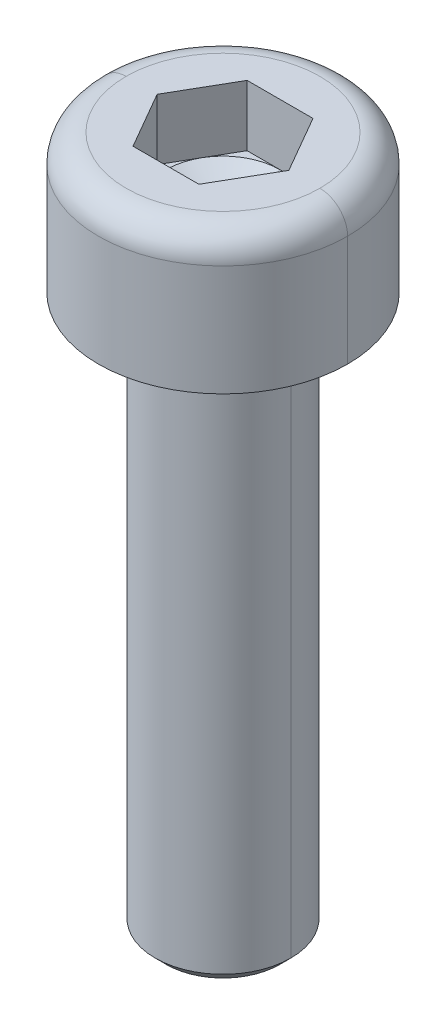
ISO-10303-21;
HEADER;
FILE_DESCRIPTION(('STEP AP214'),'2;1');
FILE_NAME('part.step','',(''),(''),'','','');
FILE_SCHEMA(('AUTOMOTIVE_DESIGN { 1 0 10303 214 1 1 1 1 }'));
ENDSEC;
DATA;
#1=APPLICATION_CONTEXT('core data for automotive mechanical design processes');
#2=APPLICATION_PROTOCOL_DEFINITION('international standard','automotive_design',2000,#1);
#3=PRODUCT_CONTEXT('',#1,'mechanical');
#4=PRODUCT('Part','Part','',(#3));
#5=PRODUCT_RELATED_PRODUCT_CATEGORY('part','',(#4));
#6=PRODUCT_DEFINITION_FORMATION('','',#4);
#7=PRODUCT_DEFINITION_CONTEXT('part definition',#1,'design');
#8=PRODUCT_DEFINITION('design','',#6,#7);
#9=PRODUCT_DEFINITION_SHAPE('','',#8);
#10=(LENGTH_UNIT() NAMED_UNIT(*) SI_UNIT(.MILLI.,.METRE.));
#11=(NAMED_UNIT(*) PLANE_ANGLE_UNIT() SI_UNIT($,.RADIAN.));
#12=(NAMED_UNIT(*) SI_UNIT($,.STERADIAN.) SOLID_ANGLE_UNIT());
#13=UNCERTAINTY_MEASURE_WITH_UNIT(LENGTH_MEASURE(1.E-05),#10,'distance_accuracy_value','');
#14=(GEOMETRIC_REPRESENTATION_CONTEXT(3) GLOBAL_UNCERTAINTY_ASSIGNED_CONTEXT((#13)) GLOBAL_UNIT_ASSIGNED_CONTEXT((#10,
#11,#12)) REPRESENTATION_CONTEXT('',''));
#15=CARTESIAN_POINT('',(0.,0.,0.));
#16=DIRECTION('',(0.,0.,1.));
#17=DIRECTION('',(1.,0.,0.));
#18=AXIS2_PLACEMENT_3D('',#15,#16,#17);
#19=CARTESIAN_POINT('',(0.,-10.,0.));
#20=DIRECTION('',(0.,-1.,0.));
#21=DIRECTION('',(0.,0.,-1.));
#22=AXIS2_PLACEMENT_3D('',#19,#20,#21);
#23=PLANE('',#22);
#24=CARTESIAN_POINT('',(0.,-9.999997107335,0.));
#25=DIRECTION('',(0.,1.,0.));
#26=DIRECTION('',(-1.,0.,0.));
#27=AXIS2_PLACEMENT_3D('',#24,#25,#26);
#28=CIRCLE('',#27,1.024996411826);
#29=CARTESIAN_POINT('',(-1.024996411826,-9.999997107335,0.));
#30=VERTEX_POINT('',#29);
#31=CARTESIAN_POINT('',(1.024996411826,-9.999997107335,0.));
#32=VERTEX_POINT('',#31);
#33=EDGE_CURVE('P0_E40',#30,#32,#28,.T.);
#34=ORIENTED_EDGE('',*,*,#33,.F.);
#35=CARTESIAN_POINT('',(0.,-9.999997107335,0.));
#36=DIRECTION('',(0.,1.,0.));
#37=DIRECTION('',(1.,0.,0.));
#38=AXIS2_PLACEMENT_3D('',#35,#36,#37);
#39=CIRCLE('',#38,1.024996411826);
#40=EDGE_CURVE('P0_E27',#32,#30,#39,.T.);
#41=ORIENTED_EDGE('',*,*,#40,.F.);
#42=EDGE_LOOP('',(#34,#41));
#43=FACE_BOUND('',#42,.T.);
#44=ADVANCED_FACE('P0_F16',(#43),#23,.T.);
#45=CARTESIAN_POINT('',(0.,-9.899996151815,0.));
#46=DIRECTION('',(0.,1.,0.));
#47=DIRECTION('',(0.,0.,-1.));
#48=AXIS2_PLACEMENT_3D('',#45,#46,#47);
#49=CONICAL_SURFACE('',#48,1.124996735065,0.785395002011216);
#50=DIRECTION('',(-0.707107572903604,-0.707105989468604,-3.40279915932002E-11));
#51=VECTOR('',#50,1.);
#52=CARTESIAN_POINT('',(1.224998063554,-9.799998063748,-8.322229612649E-11));
#53=LINE('',#52,#51);
#54=CARTESIAN_POINT('',(1.225,-9.799999164903,0.));
#55=VERTEX_POINT('',#54);
#56=EDGE_CURVE('P0_E11',#55,#32,#53,.T.);
#57=ORIENTED_EDGE('',*,*,#56,.T.);
#58=ORIENTED_EDGE('',*,*,#40,.T.);
#59=DIRECTION('',(0.707107572903604,-0.707105989468604,3.40272958864702E-11));
#60=VECTOR('',#59,1.);
#61=CARTESIAN_POINT('',(-1.224998063554,-9.799998063748,8.322240294935E-11));
#62=LINE('',#61,#60);
#63=CARTESIAN_POINT('',(-1.225,-9.799999164903,0.));
#64=VERTEX_POINT('',#63);
#65=EDGE_CURVE('P0_E179',#64,#30,#62,.T.);
#66=ORIENTED_EDGE('',*,*,#65,.F.);
#67=CARTESIAN_POINT('',(0.,-9.799999164903,0.));
#68=DIRECTION('',(0.,1.,0.));
#69=DIRECTION('',(1.,0.,0.));
#70=AXIS2_PLACEMENT_3D('',#67,#68,#69);
#71=CIRCLE('',#70,1.225);
#72=EDGE_CURVE('P0_E182',#55,#64,#71,.T.);
#73=ORIENTED_EDGE('',*,*,#72,.F.);
#74=EDGE_LOOP('',(#57,#58,#66,#73));
#75=FACE_BOUND('',#74,.T.);
#76=ADVANCED_FACE('P0_F181',(#75),#49,.T.);
#77=CARTESIAN_POINT('',(0.,3.125,0.));
#78=DIRECTION('',(0.,-1.,0.));
#79=DIRECTION('',(-1.,0.,0.));
#80=AXIS2_PLACEMENT_3D('',#77,#78,#79);
#81=CYLINDRICAL_SURFACE('',#80,1.225);
#82=DIRECTION('',(-2.01713195104496E-07,0.99999999999998,-8.66901768270682E-12));
#83=VECTOR('',#82,1.);
#84=CARTESIAN_POINT('',(-1.224998063554,-9.799998063748,8.322240294935E-11));
#85=LINE('',#84,#83);
#86=CARTESIAN_POINT('',(-1.225,-0.2,0.));
#87=VERTEX_POINT('',#86);
#88=EDGE_CURVE('P0_E193',#64,#87,#85,.T.);
#89=ORIENTED_EDGE('',*,*,#88,.T.);
#90=CARTESIAN_POINT('',(0.,-0.2,0.));
#91=DIRECTION('',(0.,1.,0.));
#92=DIRECTION('',(1.,0.,0.));
#93=AXIS2_PLACEMENT_3D('',#90,#91,#92);
#94=CIRCLE('',#93,1.225);
#95=CARTESIAN_POINT('',(1.225,-0.2,0.));
#96=VERTEX_POINT('',#95);
#97=EDGE_CURVE('P0_E301',#96,#87,#94,.T.);
#98=ORIENTED_EDGE('',*,*,#97,.F.);
#99=DIRECTION('',(2.01713195312696E-07,0.99999999999998,8.66900655532282E-12));
#100=VECTOR('',#99,1.);
#101=CARTESIAN_POINT('',(1.224998063554,-9.799998063748,-8.322229612649E-11));
#102=LINE('',#101,#100);
#103=EDGE_CURVE('P0_E196',#55,#96,#102,.T.);
#104=ORIENTED_EDGE('',*,*,#103,.F.);
#105=ORIENTED_EDGE('',*,*,#72,.T.);
#106=EDGE_LOOP('',(#89,#98,#104,#105));
#107=FACE_BOUND('',#106,.T.);
#108=ADVANCED_FACE('P0_F192',(#107),#81,.T.);
#109=CARTESIAN_POINT('',(0.,3.125,0.));
#110=DIRECTION('',(0.,-1.,0.));
#111=DIRECTION('',(-1.,0.,0.));
#112=AXIS2_PLACEMENT_3D('',#109,#110,#111);
#113=CYLINDRICAL_SURFACE('',#112,1.225);
#114=ORIENTED_EDGE('',*,*,#103,.T.);
#115=CARTESIAN_POINT('',(0.,-0.2,0.));
#116=DIRECTION('',(0.,-1.,0.));
#117=DIRECTION('',(1.,0.,0.));
#118=AXIS2_PLACEMENT_3D('',#115,#116,#117);
#119=CIRCLE('',#118,1.225);
#120=EDGE_CURVE('P0_E204',#96,#87,#119,.T.);
#121=ORIENTED_EDGE('',*,*,#120,.T.);
#122=ORIENTED_EDGE('',*,*,#88,.F.);
#123=CARTESIAN_POINT('',(0.,-9.799999164903,0.));
#124=DIRECTION('',(0.,1.,0.));
#125=DIRECTION('',(-1.,0.,0.));
#126=AXIS2_PLACEMENT_3D('',#123,#124,#125);
#127=CIRCLE('',#126,1.225);
#128=EDGE_CURVE('P0_E187',#64,#55,#127,.T.);
#129=ORIENTED_EDGE('',*,*,#128,.T.);
#130=EDGE_LOOP('',(#114,#121,#122,#129));
#131=FACE_BOUND('',#130,.T.);
#132=ADVANCED_FACE('P0_F202',(#131),#113,.T.);
#133=CARTESIAN_POINT('',(0.,-9.899996151815,0.));
#134=DIRECTION('',(0.,1.,0.));
#135=DIRECTION('',(0.,0.,-1.));
#136=AXIS2_PLACEMENT_3D('',#133,#134,#135);
#137=CONICAL_SURFACE('',#136,1.124996735065,0.785395002011216);
#138=ORIENTED_EDGE('',*,*,#65,.T.);
#139=ORIENTED_EDGE('',*,*,#33,.T.);
#140=ORIENTED_EDGE('',*,*,#56,.F.);
#141=ORIENTED_EDGE('',*,*,#128,.F.);
#142=EDGE_LOOP('',(#138,#139,#140,#141));
#143=FACE_BOUND('',#142,.T.);
#144=ADVANCED_FACE('P0_F207',(#143),#137,.T.);
#145=CARTESIAN_POINT('',(0.,-0.2,0.));
#146=DIRECTION('',(0.,-1.,0.));
#147=DIRECTION('',(-1.,0.,0.));
#148=AXIS2_PLACEMENT_3D('',#145,#146,#147);
#149=TOROIDAL_SURFACE('',#148,1.425,0.2);
#150=CARTESIAN_POINT('',(0.,0.,0.));
#151=DIRECTION('',(0.,-1.,0.));
#152=DIRECTION('',(1.,0.,0.));
#153=AXIS2_PLACEMENT_3D('',#150,#151,#152);
#154=CIRCLE('',#153,1.425);
#155=CARTESIAN_POINT('',(1.425,0.,0.));
#156=VERTEX_POINT('',#155);
#157=CARTESIAN_POINT('',(-1.425,0.,0.));
#158=VERTEX_POINT('',#157);
#159=EDGE_CURVE('P0_E326',#156,#158,#154,.T.);
#160=ORIENTED_EDGE('',*,*,#159,.T.);
#161=CARTESIAN_POINT('',(-1.425,-0.2,0.));
#162=DIRECTION('',(0.,0.,1.));
#163=DIRECTION('',(1.,0.,0.));
#164=AXIS2_PLACEMENT_3D('',#161,#162,#163);
#165=CIRCLE('',#164,0.2);
#166=EDGE_CURVE('P0_E285',#87,#158,#165,.T.);
#167=ORIENTED_EDGE('',*,*,#166,.F.);
#168=ORIENTED_EDGE('',*,*,#120,.F.);
#169=CARTESIAN_POINT('',(1.425,-0.2,0.));
#170=DIRECTION('',(0.,0.,-1.));
#171=DIRECTION('',(-1.,0.,0.));
#172=AXIS2_PLACEMENT_3D('',#169,#170,#171);
#173=CIRCLE('',#172,0.2);
#174=EDGE_CURVE('P0_E303',#96,#156,#173,.T.);
#175=ORIENTED_EDGE('',*,*,#174,.T.);
#176=EDGE_LOOP('',(#160,#167,#168,#175));
#177=FACE_BOUND('',#176,.T.);
#178=ADVANCED_FACE('P0_F453',(#177),#149,.F.);
#179=CARTESIAN_POINT('',(0.,-0.2,0.));
#180=DIRECTION('',(0.,-1.,0.));
#181=DIRECTION('',(-1.,0.,0.));
#182=AXIS2_PLACEMENT_3D('',#179,#180,#181);
#183=TOROIDAL_SURFACE('',#182,1.425,0.2);
#184=ORIENTED_EDGE('',*,*,#97,.T.);
#185=ORIENTED_EDGE('',*,*,#166,.T.);
#186=CARTESIAN_POINT('',(0.,0.,0.));
#187=DIRECTION('',(0.,1.,0.));
#188=DIRECTION('',(1.,0.,0.));
#189=AXIS2_PLACEMENT_3D('',#186,#187,#188);
#190=CIRCLE('',#189,1.425);
#191=EDGE_CURVE('P0_E286',#156,#158,#190,.T.);
#192=ORIENTED_EDGE('',*,*,#191,.F.);
#193=ORIENTED_EDGE('',*,*,#174,.F.);
#194=EDGE_LOOP('',(#184,#185,#192,#193));
#195=FACE_BOUND('',#194,.T.);
#196=ADVANCED_FACE('P0_F495',(#195),#183,.F.);
#197=CARTESIAN_POINT('',(0.,0.,0.));
#198=DIRECTION('',(0.,-1.,0.));
#199=DIRECTION('',(0.,0.,-1.));
#200=AXIS2_PLACEMENT_3D('',#197,#198,#199);
#201=PLANE('',#200);
#202=CARTESIAN_POINT('',(0.,0.,0.));
#203=DIRECTION('',(0.,-1.,0.));
#204=DIRECTION('',(1.,0.,0.));
#205=AXIS2_PLACEMENT_3D('',#202,#203,#204);
#206=CIRCLE('',#205,2.25);
#207=CARTESIAN_POINT('',(2.25,0.,0.));
#208=VERTEX_POINT('',#207);
#209=CARTESIAN_POINT('',(-2.25,0.,0.));
#210=VERTEX_POINT('',#209);
#211=EDGE_CURVE('P0_E281',#208,#210,#206,.T.);
#212=ORIENTED_EDGE('',*,*,#211,.T.);
#213=CARTESIAN_POINT('',(0.,0.,0.));
#214=DIRECTION('',(0.,1.,0.));
#215=DIRECTION('',(1.,0.,0.));
#216=AXIS2_PLACEMENT_3D('',#213,#214,#215);
#217=CIRCLE('',#216,2.25);
#218=EDGE_CURVE('P0_E334',#208,#210,#217,.T.);
#219=ORIENTED_EDGE('',*,*,#218,.F.);
#220=EDGE_LOOP('',(#212,#219));
#221=FACE_BOUND('',#220,.T.);
#222=ORIENTED_EDGE('',*,*,#191,.T.);
#223=ORIENTED_EDGE('',*,*,#159,.F.);
#224=EDGE_LOOP('',(#222,#223));
#225=FACE_BOUND('',#224,.T.);
#226=ADVANCED_FACE('P0_F493',(#221,#225),#201,.T.);
#227=CARTESIAN_POINT('',(0.,3.125,0.));
#228=DIRECTION('',(0.,-1.,0.));
#229=DIRECTION('',(-1.,0.,0.));
#230=AXIS2_PLACEMENT_3D('',#227,#228,#229);
#231=CYLINDRICAL_SURFACE('',#230,2.25);
#232=DIRECTION('',(0.,1.,2.126647948581E-11));
#233=VECTOR('',#232,1.);
#234=CARTESIAN_POINT('',(2.25,0.,0.));
#235=LINE('',#234,#233);
#236=CARTESIAN_POINT('',(2.25,2.,0.));
#237=VERTEX_POINT('',#236);
#238=EDGE_CURVE('P0_E371',#208,#237,#235,.T.);
#239=ORIENTED_EDGE('',*,*,#238,.F.);
#240=ORIENTED_EDGE('',*,*,#218,.T.);
#241=DIRECTION('',(0.,1.,-2.126718873643E-11));
#242=VECTOR('',#241,1.);
#243=CARTESIAN_POINT('',(-2.25,0.,0.));
#244=LINE('',#243,#242);
#245=CARTESIAN_POINT('',(-2.25,2.,0.));
#246=VERTEX_POINT('',#245);
#247=EDGE_CURVE('P0_E308',#210,#246,#244,.T.);
#248=ORIENTED_EDGE('',*,*,#247,.T.);
#249=CARTESIAN_POINT('',(0.,2.,0.));
#250=DIRECTION('',(0.,1.,0.));
#251=DIRECTION('',(1.,0.,0.));
#252=AXIS2_PLACEMENT_3D('',#249,#250,#251);
#253=CIRCLE('',#252,2.25);
#254=EDGE_CURVE('P0_E287',#237,#246,#253,.T.);
#255=ORIENTED_EDGE('',*,*,#254,.F.);
#256=EDGE_LOOP('',(#239,#240,#248,#255));
#257=FACE_BOUND('',#256,.T.);
#258=ADVANCED_FACE('P0_F490',(#257),#231,.T.);
#259=CARTESIAN_POINT('',(0.,2.,0.));
#260=DIRECTION('',(0.,-1.,0.));
#261=DIRECTION('',(0.999907289977928,0.,0.0136165872742304));
#262=AXIS2_PLACEMENT_3D('',#259,#260,#261);
#263=TOROIDAL_SURFACE('',#262,1.75,0.5);
#264=CARTESIAN_POINT('',(1.75,2.,0.));
#265=DIRECTION('',(0.,0.,-1.));
#266=DIRECTION('',(0.,1.,0.));
#267=AXIS2_PLACEMENT_3D('',#264,#265,#266);
#268=CIRCLE('',#267,0.5);
#269=CARTESIAN_POINT('',(1.749999979037,2.5,0.));
#270=VERTEX_POINT('',#269);
#271=EDGE_CURVE('P0_E291',#270,#237,#268,.T.);
#272=ORIENTED_EDGE('',*,*,#271,.T.);
#273=ORIENTED_EDGE('',*,*,#254,.T.);
#274=CARTESIAN_POINT('',(-1.75,2.,0.));
#275=DIRECTION('',(0.,0.,1.));
#276=DIRECTION('',(0.,1.,0.));
#277=AXIS2_PLACEMENT_3D('',#274,#275,#276);
#278=CIRCLE('',#277,0.5);
#279=CARTESIAN_POINT('',(-1.749999979037,2.5,0.));
#280=VERTEX_POINT('',#279);
#281=EDGE_CURVE('P0_E359',#280,#246,#278,.T.);
#282=ORIENTED_EDGE('',*,*,#281,.F.);
#283=CARTESIAN_POINT('',(0.,2.5,0.));
#284=DIRECTION('',(0.,1.,0.));
#285=DIRECTION('',(1.,0.,0.));
#286=AXIS2_PLACEMENT_3D('',#283,#284,#285);
#287=CIRCLE('',#286,1.749999979037);
#288=EDGE_CURVE('P0_E296',#270,#280,#287,.T.);
#289=ORIENTED_EDGE('',*,*,#288,.F.);
#290=EDGE_LOOP('',(#272,#273,#282,#289));
#291=FACE_BOUND('',#290,.T.);
#292=ADVANCED_FACE('P0_F18',(#291),#263,.T.);
#293=CARTESIAN_POINT('',(0.,2.5,0.));
#294=DIRECTION('',(0.,-1.,0.));
#295=DIRECTION('',(0.,0.,-1.));
#296=AXIS2_PLACEMENT_3D('',#293,#294,#295);
#297=PLANE('',#296);
#298=CARTESIAN_POINT('',(0.,2.5,0.));
#299=DIRECTION('',(0.,1.,0.));
#300=DIRECTION('',(-1.,0.,0.));
#301=AXIS2_PLACEMENT_3D('',#298,#299,#300);
#302=CIRCLE('',#301,1.749999979037);
#303=EDGE_CURVE('P0_E292',#280,#270,#302,.T.);
#304=ORIENTED_EDGE('',*,*,#303,.T.);
#305=ORIENTED_EDGE('',*,*,#288,.T.);
#306=EDGE_LOOP('',(#304,#305));
#307=FACE_BOUND('',#306,.T.);
#308=DIRECTION('',(0.500000000000017,0.,-0.866025403784429));
#309=VECTOR('',#308,1.);
#310=CARTESIAN_POINT('',(0.5946707772653,2.5,1.03));
#311=LINE('',#310,#309);
#312=CARTESIAN_POINT('',(0.5946707772653,2.5,1.03));
#313=VERTEX_POINT('',#312);
#314=CARTESIAN_POINT('',(1.189341554531,2.5,0.));
#315=VERTEX_POINT('',#314);
#316=EDGE_CURVE('P0_E231',#313,#315,#311,.T.);
#317=ORIENTED_EDGE('',*,*,#316,.F.);
#318=DIRECTION('',(1.,0.,0.));
#319=VECTOR('',#318,1.);
#320=CARTESIAN_POINT('',(-0.5946707772653,2.5,1.03));
#321=LINE('',#320,#319);
#322=CARTESIAN_POINT('',(-0.5946707772653,2.5,1.03));
#323=VERTEX_POINT('',#322);
#324=EDGE_CURVE('P0_E217',#323,#313,#321,.T.);
#325=ORIENTED_EDGE('',*,*,#324,.F.);
#326=DIRECTION('',(0.500000000000017,0.,0.866025403784429));
#327=VECTOR('',#326,1.);
#328=CARTESIAN_POINT('',(-1.189341554531,2.5,0.));
#329=LINE('',#328,#327);
#330=CARTESIAN_POINT('',(-1.189341554531,2.5,0.));
#331=VERTEX_POINT('',#330);
#332=EDGE_CURVE('P0_E267',#331,#323,#329,.T.);
#333=ORIENTED_EDGE('',*,*,#332,.F.);
#334=DIRECTION('',(-0.500000000000017,0.,0.866025403784429));
#335=VECTOR('',#334,1.);
#336=CARTESIAN_POINT('',(-0.5946707772653,2.5,-1.03));
#337=LINE('',#336,#335);
#338=CARTESIAN_POINT('',(-0.5946707772653,2.5,-1.03));
#339=VERTEX_POINT('',#338);
#340=EDGE_CURVE('P0_E20',#339,#331,#337,.T.);
#341=ORIENTED_EDGE('',*,*,#340,.F.);
#342=DIRECTION('',(-1.,0.,0.));
#343=VECTOR('',#342,1.);
#344=CARTESIAN_POINT('',(0.5946707772653,2.5,-1.03));
#345=LINE('',#344,#343);
#346=CARTESIAN_POINT('',(0.5946707772653,2.5,-1.03));
#347=VERTEX_POINT('',#346);
#348=EDGE_CURVE('P0_E232',#347,#339,#345,.T.);
#349=ORIENTED_EDGE('',*,*,#348,.F.);
#350=DIRECTION('',(-0.500000000000017,0.,-0.866025403784429));
#351=VECTOR('',#350,1.);
#352=CARTESIAN_POINT('',(1.189341554531,2.5,0.));
#353=LINE('',#352,#351);
#354=EDGE_CURVE('P0_E300',#315,#347,#353,.T.);
#355=ORIENTED_EDGE('',*,*,#354,.F.);
#356=EDGE_LOOP('',(#317,#325,#333,#341,#349,#355));
#357=FACE_BOUND('',#356,.T.);
#358=ADVANCED_FACE('P0_F429',(#307,#357),#297,.F.);
#359=CARTESIAN_POINT('',(1.189341554531,2.5,0.));
#360=DIRECTION('',(0.866025403784429,0.,-0.500000000000017));
#361=DIRECTION('',(0.,-1.,0.));
#362=AXIS2_PLACEMENT_3D('',#359,#360,#361);
#363=PLANE('',#362);
#364=DIRECTION('',(0.,-1.,0.));
#365=VECTOR('',#364,1.);
#366=CARTESIAN_POINT('',(1.189341554531,2.5,0.));
#367=LINE('',#366,#365);
#368=CARTESIAN_POINT('',(1.189341554531,1.4,0.));
#369=VERTEX_POINT('',#368);
#370=EDGE_CURVE('P0_E228',#315,#369,#367,.T.);
#371=ORIENTED_EDGE('',*,*,#370,.F.);
#372=ORIENTED_EDGE('',*,*,#354,.T.);
#373=DIRECTION('',(0.,-1.,0.));
#374=VECTOR('',#373,1.);
#375=CARTESIAN_POINT('',(0.5946707772653,2.5,-1.03));
#376=LINE('',#375,#374);
#377=CARTESIAN_POINT('',(0.5946707772653,1.4,-1.03));
#378=VERTEX_POINT('',#377);
#379=EDGE_CURVE('P0_E252',#347,#378,#376,.T.);
#380=ORIENTED_EDGE('',*,*,#379,.T.);
#381=DIRECTION('',(-0.500000000000017,0.,-0.866025403784429));
#382=VECTOR('',#381,1.);
#383=CARTESIAN_POINT('',(0.8920061659569,1.4,-0.5149999998979));
#384=LINE('',#383,#382);
#385=CARTESIAN_POINT('',(0.8920061660158,1.4,-0.5149999997958));
#386=VERTEX_POINT('',#385);
#387=EDGE_CURVE('P0_E262',#386,#378,#384,.T.);
#388=ORIENTED_EDGE('',*,*,#387,.F.);
#389=DIRECTION('',(-0.500000000000017,0.,-0.866025403784429));
#390=VECTOR('',#389,1.);
#391=CARTESIAN_POINT('',(1.189341554531,1.4,0.));
#392=LINE('',#391,#390);
#393=EDGE_CURVE('P0_E257',#369,#386,#392,.T.);
#394=ORIENTED_EDGE('',*,*,#393,.F.);
#395=EDGE_LOOP('',(#371,#372,#380,#388,#394));
#396=FACE_BOUND('',#395,.T.);
#397=ADVANCED_FACE('P0_F405',(#396),#363,.F.);
#398=CARTESIAN_POINT('',(0.,1.4,0.));
#399=DIRECTION('',(0.,1.,0.));
#400=DIRECTION('',(1.,0.,0.));
#401=AXIS2_PLACEMENT_3D('',#398,#399,#400);
#402=PLANE('',#401);
#403=DIRECTION('',(-1.,0.,0.));
#404=VECTOR('',#403,1.);
#405=CARTESIAN_POINT('',(0.,1.4,-1.03));
#406=LINE('',#405,#404);
#407=CARTESIAN_POINT('',(-3.031498516407E-10,1.4,-1.03));
#408=VERTEX_POINT('',#407);
#409=CARTESIAN_POINT('',(-0.5946707772653,1.4,-1.03));
#410=VERTEX_POINT('',#409);
#411=EDGE_CURVE('P0_E249',#408,#410,#406,.T.);
#412=ORIENTED_EDGE('',*,*,#411,.T.);
#413=DIRECTION('',(-0.500000000000017,0.,0.866025403784429));
#414=VECTOR('',#413,1.);
#415=CARTESIAN_POINT('',(-0.5946707772653,1.4,-1.03));
#416=LINE('',#415,#414);
#417=CARTESIAN_POINT('',(-0.8920061094995,1.4,-0.515000097685));
#418=VERTEX_POINT('',#417);
#419=EDGE_CURVE('P0_E135',#410,#418,#416,.T.);
#420=ORIENTED_EDGE('',*,*,#419,.T.);
#421=CARTESIAN_POINT('',(0.,1.4,0.));
#422=DIRECTION('',(0.,1.,0.));
#423=DIRECTION('',(-2.943202443113E-10,0.,-1.));
#424=AXIS2_PLACEMENT_3D('',#421,#422,#423);
#425=CIRCLE('',#424,1.03);
#426=EDGE_CURVE('P0_E127',#408,#418,#425,.T.);
#427=ORIENTED_EDGE('',*,*,#426,.F.);
#428=EDGE_LOOP('',(#412,#420,#427));
#429=FACE_BOUND('',#428,.T.);
#430=ADVANCED_FACE('P0_F462',(#429),#402,.T.);
#431=CARTESIAN_POINT('',(0.,1.4,0.));
#432=DIRECTION('',(0.,1.,0.));
#433=DIRECTION('',(1.,0.,0.));
#434=AXIS2_PLACEMENT_3D('',#431,#432,#433);
#435=PLANE('',#434);
#436=DIRECTION('',(-0.500000000000017,0.,0.866025403784429));
#437=VECTOR('',#436,1.);
#438=CARTESIAN_POINT('',(-0.8920061376987,1.4,-0.5150000488425));
#439=LINE('',#438,#437);
#440=CARTESIAN_POINT('',(-1.189341554531,1.4,0.));
#441=VERTEX_POINT('',#440);
#442=EDGE_CURVE('P0_E274',#418,#441,#439,.T.);
#443=ORIENTED_EDGE('',*,*,#442,.T.);
#444=DIRECTION('',(0.500000000000017,0.,0.866025403784429));
#445=VECTOR('',#444,1.);
#446=CARTESIAN_POINT('',(-1.189341554531,1.4,0.));
#447=LINE('',#446,#445);
#448=CARTESIAN_POINT('',(-0.8920061660158,1.4,0.5149999997958));
#449=VERTEX_POINT('',#448);
#450=EDGE_CURVE('P0_E278',#441,#449,#447,.T.);
#451=ORIENTED_EDGE('',*,*,#450,.T.);
#452=CARTESIAN_POINT('',(0.,1.4,0.));
#453=DIRECTION('',(0.,1.,0.));
#454=DIRECTION('',(-0.866025403784429,0.,-0.500000000000017));
#455=AXIS2_PLACEMENT_3D('',#452,#453,#454);
#456=CIRCLE('',#455,1.03);
#457=EDGE_CURVE('P0_E241',#418,#449,#456,.T.);
#458=ORIENTED_EDGE('',*,*,#457,.F.);
#459=EDGE_LOOP('',(#443,#451,#458));
#460=FACE_BOUND('',#459,.T.);
#461=ADVANCED_FACE('P0_F465',(#460),#435,.T.);
#462=CARTESIAN_POINT('',(0.,1.4,0.));
#463=DIRECTION('',(0.,1.,0.));
#464=DIRECTION('',(1.,0.,0.));
#465=AXIS2_PLACEMENT_3D('',#462,#463,#464);
#466=PLANE('',#465);
#467=DIRECTION('',(0.500000000000017,0.,0.866025403784429));
#468=VECTOR('',#467,1.);
#469=CARTESIAN_POINT('',(-0.8920061659569,1.4,0.5149999998979));
#470=LINE('',#469,#468);
#471=CARTESIAN_POINT('',(-0.5946707772653,1.4,1.03));
#472=VERTEX_POINT('',#471);
#473=EDGE_CURVE('P0_E226',#449,#472,#470,.T.);
#474=ORIENTED_EDGE('',*,*,#473,.T.);
#475=DIRECTION('',(1.,0.,0.));
#476=VECTOR('',#475,1.);
#477=CARTESIAN_POINT('',(-0.5946707772653,1.4,1.03));
#478=LINE('',#477,#476);
#479=CARTESIAN_POINT('',(-3.031497830541E-10,1.4,1.03));
#480=VERTEX_POINT('',#479);
#481=EDGE_CURVE('P0_E222',#472,#480,#478,.T.);
#482=ORIENTED_EDGE('',*,*,#481,.T.);
#483=CARTESIAN_POINT('',(0.,1.4,0.));
#484=DIRECTION('',(0.,1.,0.));
#485=DIRECTION('',(-0.866025403784429,0.,0.500000000000017));
#486=AXIS2_PLACEMENT_3D('',#483,#484,#485);
#487=CIRCLE('',#486,1.03);
#488=EDGE_CURVE('P0_E238',#449,#480,#487,.T.);
#489=ORIENTED_EDGE('',*,*,#488,.F.);
#490=EDGE_LOOP('',(#474,#482,#489));
#491=FACE_BOUND('',#490,.T.);
#492=ADVANCED_FACE('P0_F422',(#491),#466,.T.);
#493=CARTESIAN_POINT('',(0.,1.4,0.));
#494=DIRECTION('',(0.,1.,0.));
#495=DIRECTION('',(1.,0.,0.));
#496=AXIS2_PLACEMENT_3D('',#493,#494,#495);
#497=PLANE('',#496);
#498=DIRECTION('',(1.,0.,0.));
#499=VECTOR('',#498,1.);
#500=CARTESIAN_POINT('',(0.,1.4,1.03));
#501=LINE('',#500,#499);
#502=CARTESIAN_POINT('',(0.5946707772653,1.4,1.03));
#503=VERTEX_POINT('',#502);
#504=EDGE_CURVE('P0_E227',#480,#503,#501,.T.);
#505=ORIENTED_EDGE('',*,*,#504,.T.);
#506=DIRECTION('',(0.500000000000017,0.,-0.866025403784429));
#507=VECTOR('',#506,1.);
#508=CARTESIAN_POINT('',(0.5946707772653,1.4,1.03));
#509=LINE('',#508,#507);
#510=CARTESIAN_POINT('',(0.8920061657836,1.4,0.5150000001982));
#511=VERTEX_POINT('',#510);
#512=EDGE_CURVE('P0_E356',#503,#511,#509,.T.);
#513=ORIENTED_EDGE('',*,*,#512,.T.);
#514=CARTESIAN_POINT('',(0.,1.4,0.));
#515=DIRECTION('',(0.,1.,0.));
#516=DIRECTION('',(2.943196044679E-10,0.,1.));
#517=AXIS2_PLACEMENT_3D('',#514,#515,#516);
#518=CIRCLE('',#517,1.03);
#519=EDGE_CURVE('P0_E256',#480,#511,#518,.T.);
#520=ORIENTED_EDGE('',*,*,#519,.F.);
#521=EDGE_LOOP('',(#505,#513,#520));
#522=FACE_BOUND('',#521,.T.);
#523=ADVANCED_FACE('P0_F390',(#522),#497,.T.);
#524=CARTESIAN_POINT('',(0.,1.4,0.));
#525=DIRECTION('',(0.,1.,0.));
#526=DIRECTION('',(1.,0.,0.));
#527=AXIS2_PLACEMENT_3D('',#524,#525,#526);
#528=PLANE('',#527);
#529=DIRECTION('',(0.500000000000017,0.,-0.866025403784429));
#530=VECTOR('',#529,1.);
#531=CARTESIAN_POINT('',(0.8920061658408,1.4,0.5150000000991));
#532=LINE('',#531,#530);
#533=EDGE_CURVE('P0_E261',#511,#369,#532,.T.);
#534=ORIENTED_EDGE('',*,*,#533,.T.);
#535=ORIENTED_EDGE('',*,*,#393,.T.);
#536=CARTESIAN_POINT('',(0.,1.4,0.));
#537=DIRECTION('',(0.,1.,0.));
#538=DIRECTION('',(0.866025403784429,0.,0.500000000000017));
#539=AXIS2_PLACEMENT_3D('',#536,#537,#538);
#540=CIRCLE('',#539,1.03);
#541=EDGE_CURVE('P0_E236',#511,#386,#540,.T.);
#542=ORIENTED_EDGE('',*,*,#541,.F.);
#543=EDGE_LOOP('',(#534,#535,#542));
#544=FACE_BOUND('',#543,.T.);
#545=ADVANCED_FACE('P0_F396',(#544),#528,.T.);
#546=CARTESIAN_POINT('',(0.,1.4,0.));
#547=DIRECTION('',(0.,1.,0.));
#548=DIRECTION('',(1.,0.,0.));
#549=AXIS2_PLACEMENT_3D('',#546,#547,#548);
#550=PLANE('',#549);
#551=ORIENTED_EDGE('',*,*,#387,.T.);
#552=DIRECTION('',(-1.,0.,0.));
#553=VECTOR('',#552,1.);
#554=CARTESIAN_POINT('',(0.5946707772653,1.4,-1.03));
#555=LINE('',#554,#553);
#556=EDGE_CURVE('P0_E313',#378,#408,#555,.T.);
#557=ORIENTED_EDGE('',*,*,#556,.T.);
#558=CARTESIAN_POINT('',(0.,1.4,0.));
#559=DIRECTION('',(0.,1.,0.));
#560=DIRECTION('',(0.866025403784429,0.,-0.500000000000017));
#561=AXIS2_PLACEMENT_3D('',#558,#559,#560);
#562=CIRCLE('',#561,1.03);
#563=EDGE_CURVE('P0_E233',#386,#408,#562,.T.);
#564=ORIENTED_EDGE('',*,*,#563,.F.);
#565=EDGE_LOOP('',(#551,#557,#564));
#566=FACE_BOUND('',#565,.T.);
#567=ADVANCED_FACE('P0_F409',(#566),#550,.T.);
#568=CARTESIAN_POINT('',(0.,1.10861131914,0.));
#569=DIRECTION('',(0.,1.,0.));
#570=DIRECTION('',(0.,0.,-1.));
#571=AXIS2_PLACEMENT_3D('',#568,#569,#570);
#572=CONICAL_SURFACE('',#571,0.5253,1.0471975511964);
#573=ORIENTED_EDGE('',*,*,#457,.T.);
#574=ORIENTED_EDGE('',*,*,#488,.T.);
#575=DIRECTION('',(0.,0.500000000000017,0.866025403784429));
#576=VECTOR('',#575,1.);
#577=CARTESIAN_POINT('',(0.,0.8053292227347,0.));
#578=LINE('',#577,#576);
#579=CARTESIAN_POINT('',(0.,0.8053292227347,0.));
#580=VERTEX_POINT('',#579);
#581=EDGE_CURVE('P0_E237',#580,#480,#578,.T.);
#582=ORIENTED_EDGE('',*,*,#581,.F.);
#583=DIRECTION('',(0.,0.500000000000017,-0.866025403784429));
#584=VECTOR('',#583,1.);
#585=CARTESIAN_POINT('',(0.,0.8053292227347,0.));
#586=LINE('',#585,#584);
#587=EDGE_CURVE('P0_E242',#580,#408,#586,.T.);
#588=ORIENTED_EDGE('',*,*,#587,.T.);
#589=ORIENTED_EDGE('',*,*,#426,.T.);
#590=EDGE_LOOP('',(#573,#574,#582,#588,#589));
#591=FACE_BOUND('',#590,.T.);
#592=ADVANCED_FACE('P0_F414',(#591),#572,.F.);
#593=CARTESIAN_POINT('',(0.,1.10861131914,0.));
#594=DIRECTION('',(0.,1.,0.));
#595=DIRECTION('',(0.,0.,-1.));
#596=AXIS2_PLACEMENT_3D('',#593,#594,#595);
#597=CONICAL_SURFACE('',#596,0.5253,1.0471975511964);
#598=ORIENTED_EDGE('',*,*,#541,.T.);
#599=ORIENTED_EDGE('',*,*,#563,.T.);
#600=ORIENTED_EDGE('',*,*,#587,.F.);
#601=ORIENTED_EDGE('',*,*,#581,.T.);
#602=ORIENTED_EDGE('',*,*,#519,.T.);
#603=EDGE_LOOP('',(#598,#599,#600,#601,#602));
#604=FACE_BOUND('',#603,.T.);
#605=ADVANCED_FACE('P0_F401',(#604),#597,.F.);
#606=CARTESIAN_POINT('',(-0.5946707772653,2.5,-1.03));
#607=DIRECTION('',(-0.866025403784429,0.,-0.500000000000017));
#608=DIRECTION('',(-0.500000000000017,0.,0.866025403784429));
#609=AXIS2_PLACEMENT_3D('',#606,#607,#608);
#610=PLANE('',#609);
#611=DIRECTION('',(0.,-1.,0.));
#612=VECTOR('',#611,1.);
#613=CARTESIAN_POINT('',(-0.5946707772653,2.5,-1.03));
#614=LINE('',#613,#612);
#615=EDGE_CURVE('P0_E246',#339,#410,#614,.T.);
#616=ORIENTED_EDGE('',*,*,#615,.F.);
#617=ORIENTED_EDGE('',*,*,#340,.T.);
#618=DIRECTION('',(0.,-1.,0.));
#619=VECTOR('',#618,1.);
#620=CARTESIAN_POINT('',(-1.189341554531,2.5,0.));
#621=LINE('',#620,#619);
#622=EDGE_CURVE('P0_E263',#331,#441,#621,.T.);
#623=ORIENTED_EDGE('',*,*,#622,.T.);
#624=ORIENTED_EDGE('',*,*,#442,.F.);
#625=ORIENTED_EDGE('',*,*,#419,.F.);
#626=EDGE_LOOP('',(#616,#617,#623,#624,#625));
#627=FACE_BOUND('',#626,.T.);
#628=ADVANCED_FACE('P0_F432',(#627),#610,.F.);
#629=CARTESIAN_POINT('',(-1.189341554531,2.5,0.));
#630=DIRECTION('',(-0.866025403784429,0.,0.500000000000017));
#631=DIRECTION('',(0.,1.,0.));
#632=AXIS2_PLACEMENT_3D('',#629,#630,#631);
#633=PLANE('',#632);
#634=ORIENTED_EDGE('',*,*,#622,.F.);
#635=ORIENTED_EDGE('',*,*,#332,.T.);
#636=DIRECTION('',(0.,-1.,0.));
#637=VECTOR('',#636,1.);
#638=CARTESIAN_POINT('',(-0.5946707772653,2.5,1.03));
#639=LINE('',#638,#637);
#640=EDGE_CURVE('P0_E220',#323,#472,#639,.T.);
#641=ORIENTED_EDGE('',*,*,#640,.T.);
#642=ORIENTED_EDGE('',*,*,#473,.F.);
#643=ORIENTED_EDGE('',*,*,#450,.F.);
#644=EDGE_LOOP('',(#634,#635,#641,#642,#643));
#645=FACE_BOUND('',#644,.T.);
#646=ADVANCED_FACE('P0_F425',(#645),#633,.F.);
#647=CARTESIAN_POINT('',(-0.5946707772653,2.5,1.03));
#648=DIRECTION('',(0.,0.,1.));
#649=DIRECTION('',(1.,0.,0.));
#650=AXIS2_PLACEMENT_3D('',#647,#648,#649);
#651=PLANE('',#650);
#652=ORIENTED_EDGE('',*,*,#640,.F.);
#653=ORIENTED_EDGE('',*,*,#324,.T.);
#654=DIRECTION('',(0.,-1.,0.));
#655=VECTOR('',#654,1.);
#656=CARTESIAN_POINT('',(0.5946707772653,2.5,1.03));
#657=LINE('',#656,#655);
#658=EDGE_CURVE('P0_E221',#313,#503,#657,.T.);
#659=ORIENTED_EDGE('',*,*,#658,.T.);
#660=ORIENTED_EDGE('',*,*,#504,.F.);
#661=ORIENTED_EDGE('',*,*,#481,.F.);
#662=EDGE_LOOP('',(#652,#653,#659,#660,#661));
#663=FACE_BOUND('',#662,.T.);
#664=ADVANCED_FACE('P0_F421',(#663),#651,.F.);
#665=CARTESIAN_POINT('',(0.5946707772653,2.5,1.03));
#666=DIRECTION('',(0.866025403784429,0.,0.500000000000017));
#667=DIRECTION('',(0.,-1.,0.));
#668=AXIS2_PLACEMENT_3D('',#665,#666,#667);
#669=PLANE('',#668);
#670=ORIENTED_EDGE('',*,*,#658,.F.);
#671=ORIENTED_EDGE('',*,*,#316,.T.);
#672=ORIENTED_EDGE('',*,*,#370,.T.);
#673=ORIENTED_EDGE('',*,*,#533,.F.);
#674=ORIENTED_EDGE('',*,*,#512,.F.);
#675=EDGE_LOOP('',(#670,#671,#672,#673,#674));
#676=FACE_BOUND('',#675,.T.);
#677=ADVANCED_FACE('P0_F427',(#676),#669,.F.);
#678=CARTESIAN_POINT('',(0.5946707772653,2.5,-1.03));
#679=DIRECTION('',(0.,0.,-1.));
#680=DIRECTION('',(0.,-1.,0.));
#681=AXIS2_PLACEMENT_3D('',#678,#679,#680);
#682=PLANE('',#681);
#683=ORIENTED_EDGE('',*,*,#379,.F.);
#684=ORIENTED_EDGE('',*,*,#348,.T.);
#685=ORIENTED_EDGE('',*,*,#615,.T.);
#686=ORIENTED_EDGE('',*,*,#411,.F.);
#687=ORIENTED_EDGE('',*,*,#556,.F.);
#688=EDGE_LOOP('',(#683,#684,#685,#686,#687));
#689=FACE_BOUND('',#688,.T.);
#690=ADVANCED_FACE('P0_F412',(#689),#682,.F.);
#691=CARTESIAN_POINT('',(0.,2.,0.));
#692=DIRECTION('',(0.,-1.,0.));
#693=DIRECTION('',(-0.999907289977928,0.,-0.0136165872742304));
#694=AXIS2_PLACEMENT_3D('',#691,#692,#693);
#695=TOROIDAL_SURFACE('',#694,1.75,0.5);
#696=ORIENTED_EDGE('',*,*,#281,.T.);
#697=CARTESIAN_POINT('',(0.,2.,0.));
#698=DIRECTION('',(0.,1.,0.));
#699=DIRECTION('',(-1.,0.,0.));
#700=AXIS2_PLACEMENT_3D('',#697,#698,#699);
#701=CIRCLE('',#700,2.25);
#702=EDGE_CURVE('P0_E367',#246,#237,#701,.T.);
#703=ORIENTED_EDGE('',*,*,#702,.T.);
#704=ORIENTED_EDGE('',*,*,#271,.F.);
#705=ORIENTED_EDGE('',*,*,#303,.F.);
#706=EDGE_LOOP('',(#696,#703,#704,#705));
#707=FACE_BOUND('',#706,.T.);
#708=ADVANCED_FACE('P0_F475',(#707),#695,.T.);
#709=CARTESIAN_POINT('',(0.,3.125,0.));
#710=DIRECTION('',(0.,-1.,0.));
#711=DIRECTION('',(-1.,0.,0.));
#712=AXIS2_PLACEMENT_3D('',#709,#710,#711);
#713=CYLINDRICAL_SURFACE('',#712,2.25);
#714=ORIENTED_EDGE('',*,*,#247,.F.);
#715=ORIENTED_EDGE('',*,*,#211,.F.);
#716=ORIENTED_EDGE('',*,*,#238,.T.);
#717=ORIENTED_EDGE('',*,*,#702,.F.);
#718=EDGE_LOOP('',(#714,#715,#716,#717));
#719=FACE_BOUND('',#718,.T.);
#720=ADVANCED_FACE('P0_F473',(#719),#713,.T.);
#721=CLOSED_SHELL('',(#44,#76,#108,#132,#144,#178,#196,#226,#258,#292,#358,#397,#430,#461,#492,
#523,#545,#567,#592,#605,#628,#646,#664,#677,#690,#708,#720));
#722=MANIFOLD_SOLID_BREP('P0_B1',#721);
#723=CARTESIAN_POINT('',(0.,-10.,0.));
#724=DIRECTION('',(0.,1.,0.));
#725=DIRECTION('',(-1.,0.,0.));
#726=AXIS2_PLACEMENT_3D('',#723,#724,#725);
#727=CYLINDRICAL_SURFACE('',#726,1.025);
#728=CARTESIAN_POINT('',(-1.025,0.,0.));
#729=DIRECTION('',(0.,-1.,0.));
#730=VECTOR('',#729,1.);
#731=LINE('',#728,#730);
#732=CARTESIAN_POINT('',(-1.025,0.,0.));
#733=VERTEX_POINT('',#732);
#734=CARTESIAN_POINT('',(-1.025,-10.,0.));
#735=VERTEX_POINT('',#734);
#736=EDGE_CURVE('P1_E27',#733,#735,#731,.T.);
#737=ORIENTED_EDGE('',*,*,#736,.T.);
#738=CARTESIAN_POINT('',(0.,-10.,0.));
#739=DIRECTION('',(0.,1.,0.));
#740=DIRECTION('',(-1.,0.,0.));
#741=AXIS2_PLACEMENT_3D('',#738,#739,#740);
#742=CIRCLE('',#741,1.025);
#743=CARTESIAN_POINT('',(1.025,-10.,0.));
#744=VERTEX_POINT('',#743);
#745=EDGE_CURVE('P1_E11',#735,#744,#742,.T.);
#746=ORIENTED_EDGE('',*,*,#745,.T.);
#747=CARTESIAN_POINT('',(1.025,-10.,0.));
#748=DIRECTION('',(0.,1.,0.));
#749=VECTOR('',#748,1.);
#750=LINE('',#747,#749);
#751=CARTESIAN_POINT('',(1.025,0.,0.));
#752=VERTEX_POINT('',#751);
#753=EDGE_CURVE('P1_E44',#744,#752,#750,.T.);
#754=ORIENTED_EDGE('',*,*,#753,.T.);
#755=CARTESIAN_POINT('',(0.,0.,0.));
#756=DIRECTION('',(0.,-1.,0.));
#757=DIRECTION('',(1.,0.,0.));
#758=AXIS2_PLACEMENT_3D('',#755,#756,#757);
#759=CIRCLE('',#758,1.025);
#760=EDGE_CURVE('P1_E51',#752,#733,#759,.T.);
#761=ORIENTED_EDGE('',*,*,#760,.T.);
#762=EDGE_LOOP('',(#737,#746,#754,#761));
#763=FACE_BOUND('',#762,.T.);
#764=ADVANCED_FACE('P1_F16',(#763),#727,.T.);
#765=CARTESIAN_POINT('',(0.,-10.,0.));
#766=DIRECTION('',(0.,1.,0.));
#767=DIRECTION('',(-1.,0.,0.));
#768=AXIS2_PLACEMENT_3D('',#765,#766,#767);
#769=CYLINDRICAL_SURFACE('',#768,1.025);
#770=ORIENTED_EDGE('',*,*,#753,.F.);
#771=CARTESIAN_POINT('',(0.,-10.,0.));
#772=DIRECTION('',(0.,1.,0.));
#773=DIRECTION('',(1.,0.,0.));
#774=AXIS2_PLACEMENT_3D('',#771,#772,#773);
#775=CIRCLE('',#774,1.025);
#776=EDGE_CURVE('P1_E35',#744,#735,#775,.T.);
#777=ORIENTED_EDGE('',*,*,#776,.T.);
#778=ORIENTED_EDGE('',*,*,#736,.F.);
#779=CARTESIAN_POINT('',(0.,0.,0.));
#780=DIRECTION('',(0.,-1.,0.));
#781=DIRECTION('',(-1.,0.,0.));
#782=AXIS2_PLACEMENT_3D('',#779,#780,#781);
#783=CIRCLE('',#782,1.025);
#784=EDGE_CURVE('P1_E41',#733,#752,#783,.T.);
#785=ORIENTED_EDGE('',*,*,#784,.T.);
#786=EDGE_LOOP('',(#770,#777,#778,#785));
#787=FACE_BOUND('',#786,.T.);
#788=ADVANCED_FACE('P1_F17',(#787),#769,.T.);
#789=OPEN_SHELL('',(#764,#788));
#790=SHELL_BASED_SURFACE_MODEL('P1_B1',(#789));
#791=ADVANCED_BREP_SHAPE_REPRESENTATION('',(#18,#722),#14);
#792=MANIFOLD_SURFACE_SHAPE_REPRESENTATION('',(#18,#790),#14);
#793=SHAPE_REPRESENTATION('',(#18),#14);
#794=SHAPE_DEFINITION_REPRESENTATION(#9,#793);
#795=SHAPE_REPRESENTATION_RELATIONSHIP('','',#793,#791);
#796=SHAPE_REPRESENTATION_RELATIONSHIP('','',#793,#792);
ENDSEC;
END-ISO-10303-21;
